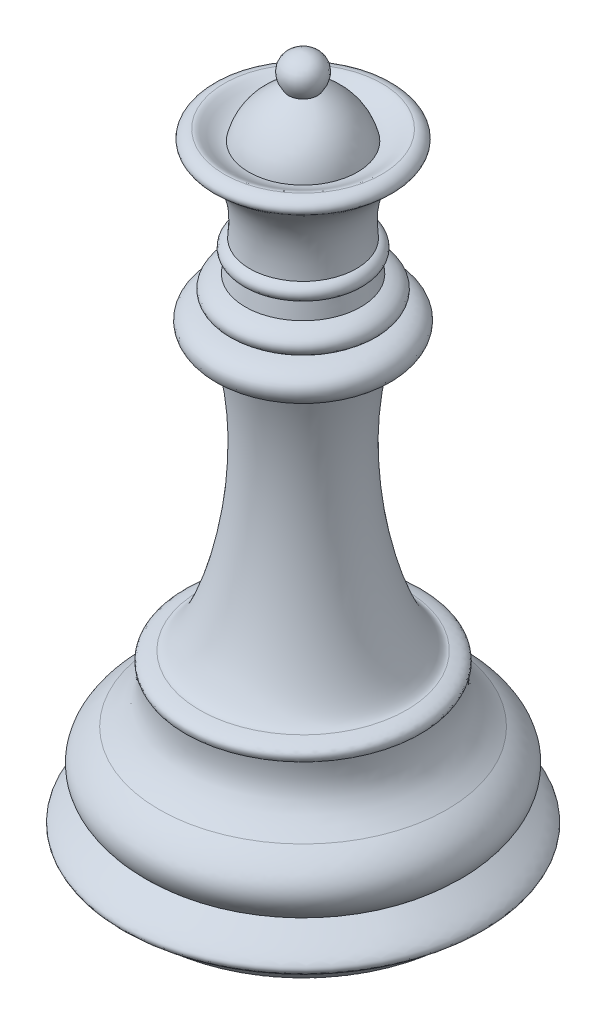
ISO-10303-21;
HEADER;
FILE_DESCRIPTION(('STEP AP214'),'2;1');
FILE_NAME('part.step','',(''),(''),'','','');
FILE_SCHEMA(('AUTOMOTIVE_DESIGN { 1 0 10303 214 1 1 1 1 }'));
ENDSEC;
DATA;
#1=APPLICATION_CONTEXT('core data for automotive mechanical design processes');
#2=APPLICATION_PROTOCOL_DEFINITION('international standard','automotive_design',2000,#1);
#3=PRODUCT_CONTEXT('',#1,'mechanical');
#4=PRODUCT('Part','Part','',(#3));
#5=PRODUCT_RELATED_PRODUCT_CATEGORY('part','',(#4));
#6=PRODUCT_DEFINITION_FORMATION('','',#4);
#7=PRODUCT_DEFINITION_CONTEXT('part definition',#1,'design');
#8=PRODUCT_DEFINITION('design','',#6,#7);
#9=PRODUCT_DEFINITION_SHAPE('','',#8);
#10=(LENGTH_UNIT() NAMED_UNIT(*) SI_UNIT(.MILLI.,.METRE.));
#11=(NAMED_UNIT(*) PLANE_ANGLE_UNIT() SI_UNIT($,.RADIAN.));
#12=(NAMED_UNIT(*) SI_UNIT($,.STERADIAN.) SOLID_ANGLE_UNIT());
#13=UNCERTAINTY_MEASURE_WITH_UNIT(LENGTH_MEASURE(1.E-05),#10,'distance_accuracy_value','');
#14=(GEOMETRIC_REPRESENTATION_CONTEXT(3) GLOBAL_UNCERTAINTY_ASSIGNED_CONTEXT((#13)) GLOBAL_UNIT_ASSIGNED_CONTEXT((#10,
#11,#12)) REPRESENTATION_CONTEXT('',''));
#15=CARTESIAN_POINT('',(0.,0.,0.));
#16=DIRECTION('',(0.,0.,1.));
#17=DIRECTION('',(1.,0.,0.));
#18=AXIS2_PLACEMENT_3D('',#15,#16,#17);
#19=CARTESIAN_POINT('',(7.41284485599827,343.298797664638,0.));
#20=CARTESIAN_POINT('',(13.0746309784234,351.114266042462,0.));
#21=CARTESIAN_POINT('',(8.87011369662722,358.700109744421,0.));
#22=CARTESIAN_POINT('',(0.,359.184944691156,0.));
#23=B_SPLINE_CURVE_WITH_KNOTS('',3,(#19,#20,#21,#22),.UNSPECIFIED.,.F.,.F.,(4,4),(0.,1.),.UNSPECIFIED.);
#24=CARTESIAN_POINT('',(0.,359.184944691156,0.));
#25=DIRECTION('',(0.,1.,0.));
#26=AXIS1_PLACEMENT('',#24,#25);
#27=SURFACE_OF_REVOLUTION('',#23,#26);
#28=CARTESIAN_POINT('',(0.,359.184944691156,0.));
#29=VERTEX_POINT('',#28);
#30=VERTEX_LOOP('',#29);
#31=FACE_BOUND('',#30,.T.);
#32=CARTESIAN_POINT('',(0.,343.298797664638,0.));
#33=DIRECTION('',(0.,1.,0.));
#34=DIRECTION('',(0.,0.,1.));
#35=AXIS2_PLACEMENT_3D('',#32,#33,#34);
#36=CIRCLE('',#35,7.41284485599825);
#37=CARTESIAN_POINT('',(0.,343.298797664638,7.41284485599825));
#38=VERTEX_POINT('',#37);
#39=EDGE_CURVE('E11',#38,#38,#36,.T.);
#40=ORIENTED_EDGE('',*,*,#39,.T.);
#41=EDGE_LOOP('',(#40));
#42=FACE_BOUND('',#41,.T.);
#43=ADVANCED_FACE('F32',(#31,#42),#27,.T.);
#44=CARTESIAN_POINT('',(27.7896466595502,319.565226832293,0.));
#45=CARTESIAN_POINT('',(24.1283319295199,334.644221206279,0.));
#46=CARTESIAN_POINT('',(7.41284485599825,343.298797664638,0.));
#47=B_SPLINE_CURVE_WITH_KNOTS('',2,(#44,#45,#46),.UNSPECIFIED.,.F.,.F.,(3,3),(0.,1.),.UNSPECIFIED.);
#48=CARTESIAN_POINT('',(0.,359.184944691156,0.));
#49=DIRECTION('',(0.,1.,0.));
#50=AXIS1_PLACEMENT('',#48,#49);
#51=SURFACE_OF_REVOLUTION('',#47,#50);
#52=ORIENTED_EDGE('',*,*,#39,.F.);
#53=EDGE_LOOP('',(#52));
#54=FACE_BOUND('',#53,.T.);
#55=CARTESIAN_POINT('',(0.,319.565226832293,0.));
#56=DIRECTION('',(0.,1.,0.));
#57=DIRECTION('',(0.,0.,1.));
#58=AXIS2_PLACEMENT_3D('',#55,#56,#57);
#59=CIRCLE('',#58,27.7896466595502);
#60=CARTESIAN_POINT('',(0.,319.565226832293,27.7896466595502));
#61=VERTEX_POINT('',#60);
#62=EDGE_CURVE('E39',#61,#61,#59,.T.);
#63=ORIENTED_EDGE('',*,*,#62,.T.);
#64=EDGE_LOOP('',(#63));
#65=FACE_BOUND('',#64,.T.);
#66=ADVANCED_FACE('F44',(#54,#65),#51,.T.);
#67=CARTESIAN_POINT('',(40.3444135158857,324.893880908169,0.));
#68=CARTESIAN_POINT('',(37.4037077942243,325.106041395029,0.));
#69=CARTESIAN_POINT('',(34.1857714948063,320.757051335756,0.));
#70=CARTESIAN_POINT('',(27.7896466595502,319.565226832293,0.));
#71=B_SPLINE_CURVE_WITH_KNOTS('',3,(#67,#68,#69,#70),.UNSPECIFIED.,.F.,.F.,(4,4),(0.,1.),.UNSPECIFIED.);
#72=CARTESIAN_POINT('',(0.,359.184944691156,0.));
#73=DIRECTION('',(0.,1.,0.));
#74=AXIS1_PLACEMENT('',#72,#73);
#75=SURFACE_OF_REVOLUTION('',#71,#74);
#76=ORIENTED_EDGE('',*,*,#62,.F.);
#77=EDGE_LOOP('',(#76));
#78=FACE_BOUND('',#77,.T.);
#79=CARTESIAN_POINT('',(0.,324.893880908169,0.));
#80=DIRECTION('',(0.,1.,0.));
#81=DIRECTION('',(0.,0.,1.));
#82=AXIS2_PLACEMENT_3D('',#79,#80,#81);
#83=CIRCLE('',#82,40.3444135158857);
#84=CARTESIAN_POINT('',(0.,324.893880908169,40.3444135158857));
#85=VERTEX_POINT('',#84);
#86=EDGE_CURVE('E53',#85,#85,#83,.T.);
#87=ORIENTED_EDGE('',*,*,#86,.T.);
#88=EDGE_LOOP('',(#87));
#89=FACE_BOUND('',#88,.T.);
#90=ADVANCED_FACE('F49',(#78,#89),#75,.T.);
#91=CARTESIAN_POINT('',(44.748312808948,318.229603473041,0.));
#92=CARTESIAN_POINT('',(48.1452670244172,320.857721978706,0.));
#93=CARTESIAN_POINT('',(44.2823785701132,324.811839969539,0.));
#94=CARTESIAN_POINT('',(40.3444135158857,324.893880908169,0.));
#95=B_SPLINE_CURVE_WITH_KNOTS('',3,(#91,#92,#93,#94),.UNSPECIFIED.,.F.,.F.,(4,4),(0.,1.),.UNSPECIFIED.);
#96=CARTESIAN_POINT('',(0.,359.184944691156,0.));
#97=DIRECTION('',(0.,1.,0.));
#98=AXIS1_PLACEMENT('',#96,#97);
#99=SURFACE_OF_REVOLUTION('',#95,#98);
#100=ORIENTED_EDGE('',*,*,#86,.F.);
#101=EDGE_LOOP('',(#100));
#102=FACE_BOUND('',#101,.T.);
#103=CARTESIAN_POINT('',(0.,318.229603473041,0.));
#104=DIRECTION('',(0.,1.,0.));
#105=DIRECTION('',(0.,0.,1.));
#106=AXIS2_PLACEMENT_3D('',#103,#104,#105);
#107=CIRCLE('',#106,44.748312808948);
#108=CARTESIAN_POINT('',(0.,318.229603473041,44.748312808948));
#109=VERTEX_POINT('',#108);
#110=EDGE_CURVE('E55',#109,#109,#107,.T.);
#111=ORIENTED_EDGE('',*,*,#110,.T.);
#112=EDGE_LOOP('',(#111));
#113=FACE_BOUND('',#112,.T.);
#114=ADVANCED_FACE('F113',(#102,#113),#99,.T.);
#115=CARTESIAN_POINT('',(27.3372541904625,276.555118921493,0.));
#116=CARTESIAN_POINT('',(25.1832383118433,296.479848112039,0.));
#117=CARTESIAN_POINT('',(30.1826019331124,307.572661899704,0.));
#118=CARTESIAN_POINT('',(44.748312808948,318.229603473041,0.));
#119=B_SPLINE_CURVE_WITH_KNOTS('',3,(#115,#116,#117,#118),.UNSPECIFIED.,.F.,.F.,(4,4),(0.,1.),.UNSPECIFIED.);
#120=CARTESIAN_POINT('',(0.,359.184944691156,0.));
#121=DIRECTION('',(0.,1.,0.));
#122=AXIS1_PLACEMENT('',#120,#121);
#123=SURFACE_OF_REVOLUTION('',#119,#122);
#124=ORIENTED_EDGE('',*,*,#110,.F.);
#125=EDGE_LOOP('',(#124));
#126=FACE_BOUND('',#125,.T.);
#127=CARTESIAN_POINT('',(0.,276.555118921493,0.));
#128=DIRECTION('',(0.,1.,0.));
#129=DIRECTION('',(0.,0.,1.));
#130=AXIS2_PLACEMENT_3D('',#127,#128,#129);
#131=CIRCLE('',#130,27.3372541904625);
#132=CARTESIAN_POINT('',(0.,276.555118921493,27.3372541904625));
#133=VERTEX_POINT('',#132);
#134=EDGE_CURVE('E60',#133,#133,#131,.T.);
#135=ORIENTED_EDGE('',*,*,#134,.T.);
#136=EDGE_LOOP('',(#135));
#137=FACE_BOUND('',#136,.T.);
#138=ADVANCED_FACE('F116',(#126,#137),#123,.T.);
#139=CARTESIAN_POINT('',(28.2565861020559,268.497553784213,0.));
#140=CARTESIAN_POINT('',(32.8629392428129,270.914149405468,0.));
#141=CARTESIAN_POINT('',(31.5271639690401,275.346491100749,0.));
#142=CARTESIAN_POINT('',(27.3372541904625,276.555118921493,0.));
#143=B_SPLINE_CURVE_WITH_KNOTS('',3,(#139,#140,#141,#142),.UNSPECIFIED.,.F.,.F.,(4,4),(0.,1.),.UNSPECIFIED.);
#144=CARTESIAN_POINT('',(0.,359.184944691156,0.));
#145=DIRECTION('',(0.,1.,0.));
#146=AXIS1_PLACEMENT('',#144,#145);
#147=SURFACE_OF_REVOLUTION('',#143,#146);
#148=ORIENTED_EDGE('',*,*,#134,.F.);
#149=EDGE_LOOP('',(#148));
#150=FACE_BOUND('',#149,.T.);
#151=CARTESIAN_POINT('',(0.,268.497553784213,0.));
#152=DIRECTION('',(0.,1.,0.));
#153=DIRECTION('',(0.,0.,1.));
#154=AXIS2_PLACEMENT_3D('',#151,#152,#153);
#155=CIRCLE('',#154,28.2565861020559);
#156=CARTESIAN_POINT('',(0.,268.497553784213,28.2565861020559));
#157=VERTEX_POINT('',#156);
#158=EDGE_CURVE('E63',#157,#157,#155,.T.);
#159=ORIENTED_EDGE('',*,*,#158,.T.);
#160=EDGE_LOOP('',(#159));
#161=FACE_BOUND('',#160,.T.);
#162=ADVANCED_FACE('F144',(#150,#161),#147,.T.);
#163=CARTESIAN_POINT('',(0.,260.712647956838,0.));
#164=DIRECTION('',(0.,-1.,0.));
#165=DIRECTION('',(0.,0.,-1.));
#166=AXIS2_PLACEMENT_3D('',#163,#164,#165);
#167=CONICAL_SURFACE('',#166,29.595744906958,0.170352674559947);
#168=ORIENTED_EDGE('',*,*,#158,.F.);
#169=EDGE_LOOP('',(#168));
#170=FACE_BOUND('',#169,.T.);
#171=CARTESIAN_POINT('',(0.,260.712647956838,0.));
#172=DIRECTION('',(0.,1.,0.));
#173=DIRECTION('',(0.,0.,1.));
#174=AXIS2_PLACEMENT_3D('',#171,#172,#173);
#175=CIRCLE('',#174,29.595744906958);
#176=CARTESIAN_POINT('',(0.,260.712647956838,29.595744906958));
#177=VERTEX_POINT('',#176);
#178=EDGE_CURVE('E66',#177,#177,#175,.T.);
#179=ORIENTED_EDGE('',*,*,#178,.T.);
#180=EDGE_LOOP('',(#179));
#181=FACE_BOUND('',#180,.T.);
#182=ADVANCED_FACE('F147',(#170,#181),#167,.T.);
#183=CARTESIAN_POINT('',(33.0218730459721,248.433814157952,0.));
#184=CARTESIAN_POINT('',(40.7500756213786,251.197915809009,0.));
#185=CARTESIAN_POINT('',(40.902675060227,258.039777630746,0.));
#186=CARTESIAN_POINT('',(29.595744906958,260.712647956838,0.));
#187=B_SPLINE_CURVE_WITH_KNOTS('',3,(#183,#184,#185,#186),.UNSPECIFIED.,.F.,.F.,(4,4),(0.,1.),.UNSPECIFIED.);
#188=CARTESIAN_POINT('',(0.,359.184944691156,0.));
#189=DIRECTION('',(0.,1.,0.));
#190=AXIS1_PLACEMENT('',#188,#189);
#191=SURFACE_OF_REVOLUTION('',#187,#190);
#192=ORIENTED_EDGE('',*,*,#178,.F.);
#193=EDGE_LOOP('',(#192));
#194=FACE_BOUND('',#193,.T.);
#195=CARTESIAN_POINT('',(0.,248.433814157952,0.));
#196=DIRECTION('',(0.,1.,0.));
#197=DIRECTION('',(0.,0.,1.));
#198=AXIS2_PLACEMENT_3D('',#195,#196,#197);
#199=CIRCLE('',#198,33.0218730459721);
#200=CARTESIAN_POINT('',(0.,248.433814157952,33.0218730459721));
#201=VERTEX_POINT('',#200);
#202=EDGE_CURVE('E69',#201,#201,#199,.T.);
#203=ORIENTED_EDGE('',*,*,#202,.T.);
#204=EDGE_LOOP('',(#203));
#205=FACE_BOUND('',#204,.T.);
#206=ADVANCED_FACE('F151',(#194,#205),#191,.T.);
#207=CARTESIAN_POINT('',(39.0930229052341,232.37955565956,0.));
#208=CARTESIAN_POINT('',(47.1365225853545,232.271615029338,0.));
#209=CARTESIAN_POINT('',(53.9112609144218,247.231706032792,0.));
#210=CARTESIAN_POINT('',(33.0218730459721,248.433814157952,0.));
#211=B_SPLINE_CURVE_WITH_KNOTS('',3,(#207,#208,#209,#210),.UNSPECIFIED.,.F.,.F.,(4,4),(0.,1.),.UNSPECIFIED.);
#212=CARTESIAN_POINT('',(0.,359.184944691156,0.));
#213=DIRECTION('',(0.,1.,0.));
#214=AXIS1_PLACEMENT('',#212,#213);
#215=SURFACE_OF_REVOLUTION('',#211,#214);
#216=ORIENTED_EDGE('',*,*,#202,.F.);
#217=EDGE_LOOP('',(#216));
#218=FACE_BOUND('',#217,.T.);
#219=CARTESIAN_POINT('',(0.,232.37955565956,0.));
#220=DIRECTION('',(0.,1.,0.));
#221=DIRECTION('',(0.,0.,1.));
#222=AXIS2_PLACEMENT_3D('',#219,#220,#221);
#223=CIRCLE('',#222,39.0930229052341);
#224=CARTESIAN_POINT('',(0.,232.37955565956,39.0930229052341));
#225=VERTEX_POINT('',#224);
#226=EDGE_CURVE('E72',#225,#225,#223,.T.);
#227=ORIENTED_EDGE('',*,*,#226,.T.);
#228=EDGE_LOOP('',(#227));
#229=FACE_BOUND('',#228,.T.);
#230=ADVANCED_FACE('F155',(#218,#229),#215,.T.);
#231=CARTESIAN_POINT('',(33.3206594452601,232.37955565956,0.));
#232=DIRECTION('',(0.,1.,0.));
#233=DIRECTION('',(0.,0.,1.));
#234=AXIS2_PLACEMENT_3D('',#231,#232,#233);
#235=PLANE('',#234);
#236=ORIENTED_EDGE('',*,*,#226,.F.);
#237=EDGE_LOOP('',(#236));
#238=FACE_BOUND('',#237,.T.);
#239=CARTESIAN_POINT('',(0.,232.37955565956,0.));
#240=DIRECTION('',(0.,1.,0.));
#241=DIRECTION('',(0.,0.,1.));
#242=AXIS2_PLACEMENT_3D('',#239,#240,#241);
#243=CIRCLE('',#242,33.3206594452601);
#244=CARTESIAN_POINT('',(0.,232.37955565956,33.3206594452601));
#245=VERTEX_POINT('',#244);
#246=EDGE_CURVE('E75',#245,#245,#243,.T.);
#247=ORIENTED_EDGE('',*,*,#246,.T.);
#248=EDGE_LOOP('',(#247));
#249=FACE_BOUND('',#248,.T.);
#250=ADVANCED_FACE('F159',(#238,#249),#235,.F.);
#251=CARTESIAN_POINT('',(52.9446372320576,93.6360251321343,0.));
#252=CARTESIAN_POINT('',(41.4211611829045,94.2329809849998,0.));
#253=CARTESIAN_POINT('',(15.325874546483,170.254392135433,0.));
#254=CARTESIAN_POINT('',(33.3206594452601,232.37955565956,0.));
#255=B_SPLINE_CURVE_WITH_KNOTS('',3,(#251,#252,#253,#254),.UNSPECIFIED.,.F.,.F.,(4,4),(0.,1.),.UNSPECIFIED.);
#256=CARTESIAN_POINT('',(0.,359.184944691156,0.));
#257=DIRECTION('',(0.,1.,0.));
#258=AXIS1_PLACEMENT('',#256,#257);
#259=SURFACE_OF_REVOLUTION('',#255,#258);
#260=ORIENTED_EDGE('',*,*,#246,.F.);
#261=EDGE_LOOP('',(#260));
#262=FACE_BOUND('',#261,.T.);
#263=CARTESIAN_POINT('',(0.,93.6360251321343,0.));
#264=DIRECTION('',(0.,1.,0.));
#265=DIRECTION('',(0.,0.,1.));
#266=AXIS2_PLACEMENT_3D('',#263,#264,#265);
#267=CIRCLE('',#266,52.9446372320575);
#268=CARTESIAN_POINT('',(0.,93.6360251321343,52.9446372320575));
#269=VERTEX_POINT('',#268);
#270=EDGE_CURVE('E78',#269,#269,#267,.T.);
#271=ORIENTED_EDGE('',*,*,#270,.T.);
#272=EDGE_LOOP('',(#271));
#273=FACE_BOUND('',#272,.T.);
#274=ADVANCED_FACE('F180',(#262,#273),#259,.T.);
#275=CARTESIAN_POINT('',(60.147987155991,86.7062201420211,0.));
#276=CARTESIAN_POINT('',(62.5024406708775,90.8132879338587,0.));
#277=CARTESIAN_POINT('',(58.9970887876223,92.4700244176754,0.));
#278=CARTESIAN_POINT('',(52.9446372320575,93.6360251321343,0.));
#279=B_SPLINE_CURVE_WITH_KNOTS('',3,(#275,#276,#277,#278),.UNSPECIFIED.,.F.,.F.,(4,4),(0.,1.),.UNSPECIFIED.);
#280=CARTESIAN_POINT('',(0.,359.184944691156,0.));
#281=DIRECTION('',(0.,1.,0.));
#282=AXIS1_PLACEMENT('',#280,#281);
#283=SURFACE_OF_REVOLUTION('',#279,#282);
#284=ORIENTED_EDGE('',*,*,#270,.F.);
#285=EDGE_LOOP('',(#284));
#286=FACE_BOUND('',#285,.T.);
#287=CARTESIAN_POINT('',(0.,86.7062201420211,0.));
#288=DIRECTION('',(0.,1.,0.));
#289=DIRECTION('',(0.,0.,1.));
#290=AXIS2_PLACEMENT_3D('',#287,#288,#289);
#291=CIRCLE('',#290,60.147987155991);
#292=CARTESIAN_POINT('',(0.,86.7062201420211,60.147987155991));
#293=VERTEX_POINT('',#292);
#294=EDGE_CURVE('E81',#293,#293,#291,.T.);
#295=ORIENTED_EDGE('',*,*,#294,.T.);
#296=EDGE_LOOP('',(#295));
#297=FACE_BOUND('',#296,.T.);
#298=ADVANCED_FACE('F183',(#286,#297),#283,.T.);
#299=CARTESIAN_POINT('',(73.6465395800102,59.8830793581869,0.));
#300=CARTESIAN_POINT('',(62.2169420057843,68.1284224646947,0.));
#301=CARTESIAN_POINT('',(59.0624553310577,73.8751155814071,0.));
#302=CARTESIAN_POINT('',(60.147987155991,86.7062201420211,0.));
#303=B_SPLINE_CURVE_WITH_KNOTS('',3,(#299,#300,#301,#302),.UNSPECIFIED.,.F.,.F.,(4,4),(0.,1.),.UNSPECIFIED.);
#304=CARTESIAN_POINT('',(0.,359.184944691156,0.));
#305=DIRECTION('',(0.,1.,0.));
#306=AXIS1_PLACEMENT('',#304,#305);
#307=SURFACE_OF_REVOLUTION('',#303,#306);
#308=ORIENTED_EDGE('',*,*,#294,.F.);
#309=EDGE_LOOP('',(#308));
#310=FACE_BOUND('',#309,.T.);
#311=CARTESIAN_POINT('',(0.,59.8830793581869,0.));
#312=DIRECTION('',(0.,1.,0.));
#313=DIRECTION('',(0.,0.,1.));
#314=AXIS2_PLACEMENT_3D('',#311,#312,#313);
#315=CIRCLE('',#314,73.6465395800101);
#316=CARTESIAN_POINT('',(0.,59.8830793581869,73.6465395800101));
#317=VERTEX_POINT('',#316);
#318=EDGE_CURVE('E84',#317,#317,#315,.T.);
#319=ORIENTED_EDGE('',*,*,#318,.T.);
#320=EDGE_LOOP('',(#319));
#321=FACE_BOUND('',#320,.T.);
#322=ADVANCED_FACE('F187',(#310,#321),#307,.T.);
#323=CARTESIAN_POINT('',(77.6417521769054,29.9551925473514,0.));
#324=CARTESIAN_POINT('',(91.0533824965401,40.8086144175693,0.));
#325=CARTESIAN_POINT('',(87.4784774812101,51.3444116769209,0.));
#326=CARTESIAN_POINT('',(73.6465395800101,59.8830793581869,0.));
#327=B_SPLINE_CURVE_WITH_KNOTS('',3,(#323,#324,#325,#326),.UNSPECIFIED.,.F.,.F.,(4,4),(0.,1.),.UNSPECIFIED.);
#328=CARTESIAN_POINT('',(0.,359.184944691156,0.));
#329=DIRECTION('',(0.,1.,0.));
#330=AXIS1_PLACEMENT('',#328,#329);
#331=SURFACE_OF_REVOLUTION('',#327,#330);
#332=ORIENTED_EDGE('',*,*,#318,.F.);
#333=EDGE_LOOP('',(#332));
#334=FACE_BOUND('',#333,.T.);
#335=CARTESIAN_POINT('',(0.,29.9551925473514,0.));
#336=DIRECTION('',(0.,1.,0.));
#337=DIRECTION('',(0.,0.,1.));
#338=AXIS2_PLACEMENT_3D('',#335,#336,#337);
#339=CIRCLE('',#338,77.6417521769054);
#340=CARTESIAN_POINT('',(0.,29.9551925473514,77.6417521769054));
#341=VERTEX_POINT('',#340);
#342=EDGE_CURVE('E87',#341,#341,#339,.T.);
#343=ORIENTED_EDGE('',*,*,#342,.T.);
#344=EDGE_LOOP('',(#343));
#345=FACE_BOUND('',#344,.T.);
#346=ADVANCED_FACE('F191',(#334,#345),#331,.T.);
#347=CARTESIAN_POINT('',(70.3874841788861,0.,0.));
#348=CARTESIAN_POINT('',(77.617061204241,1.61582717658979,0.));
#349=CARTESIAN_POINT('',(79.6889569316613,6.57919687232512,0.));
#350=CARTESIAN_POINT('',(95.9558838133994,17.8492981932137,0.));
#351=CARTESIAN_POINT('',(96.5244497455944,17.2630107553255,0.));
#352=CARTESIAN_POINT('',(77.6417521769054,29.9551925473514,0.));
#353=B_SPLINE_CURVE_WITH_KNOTS('',3,(#347,#348,#349,#350,#351,#352),.UNSPECIFIED.,.F.,.F.,(4,1,
1,4),(0.,0.222477679582125,0.322477679582125,1.),.UNSPECIFIED.);
#354=CARTESIAN_POINT('',(0.,359.184944691156,0.));
#355=DIRECTION('',(0.,1.,0.));
#356=AXIS1_PLACEMENT('',#354,#355);
#357=SURFACE_OF_REVOLUTION('',#353,#356);
#358=ORIENTED_EDGE('',*,*,#342,.F.);
#359=EDGE_LOOP('',(#358));
#360=FACE_BOUND('',#359,.T.);
#361=CARTESIAN_POINT('',(0.,0.,0.));
#362=DIRECTION('',(0.,1.,0.));
#363=DIRECTION('',(0.,0.,1.));
#364=AXIS2_PLACEMENT_3D('',#361,#362,#363);
#365=CIRCLE('',#364,70.3874841788861);
#366=CARTESIAN_POINT('',(0.,0.,70.3874841788861));
#367=VERTEX_POINT('',#366);
#368=EDGE_CURVE('E90',#367,#367,#365,.T.);
#369=ORIENTED_EDGE('',*,*,#368,.T.);
#370=EDGE_LOOP('',(#369));
#371=FACE_BOUND('',#370,.T.);
#372=ADVANCED_FACE('F214',(#360,#371),#357,.T.);
#373=CARTESIAN_POINT('',(0.,0.,0.));
#374=DIRECTION('',(0.,1.,0.));
#375=DIRECTION('',(0.,0.,1.));
#376=AXIS2_PLACEMENT_3D('',#373,#374,#375);
#377=PLANE('',#376);
#378=ORIENTED_EDGE('',*,*,#368,.F.);
#379=EDGE_LOOP('',(#378));
#380=FACE_BOUND('',#379,.T.);
#381=ADVANCED_FACE('F217',(#380),#377,.F.);
#382=CLOSED_SHELL('',(#43,#66,#90,#114,#138,#162,#182,#206,#230,#250,#274,#298,#322,#346,#372,#381));
#383=MANIFOLD_SOLID_BREP('B2',#382);
#384=ADVANCED_BREP_SHAPE_REPRESENTATION('',(#18,#383),#14);
#385=SHAPE_DEFINITION_REPRESENTATION(#9,#384);
ENDSEC;
END-ISO-10303-21;
